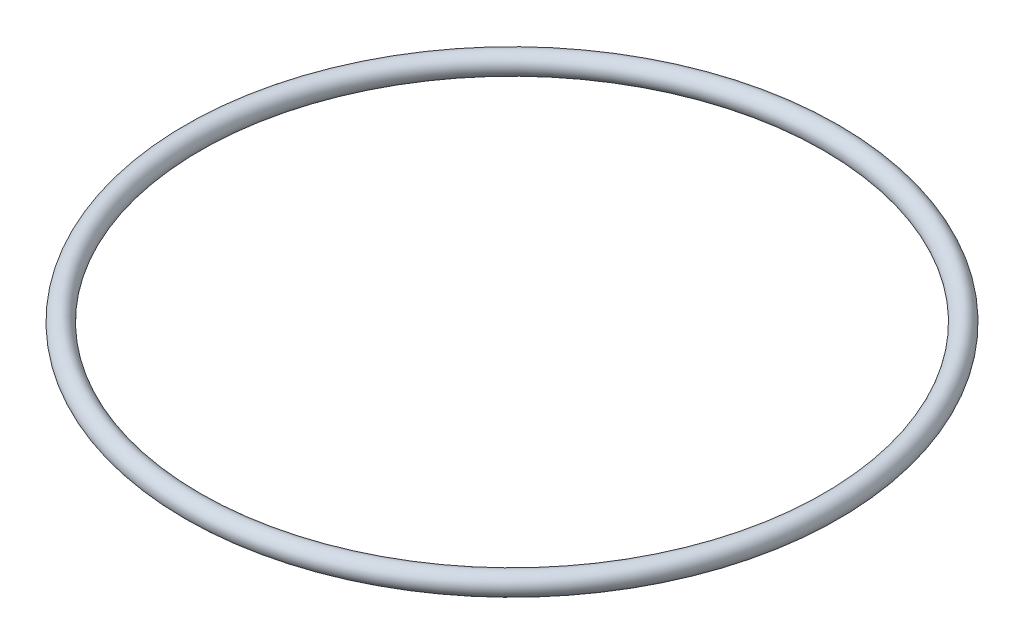
ISO-10303-21;
HEADER;
FILE_DESCRIPTION(('STEP AP214'),'2;1');
FILE_NAME('part.step','',(''),(''),'','','');
FILE_SCHEMA(('AUTOMOTIVE_DESIGN { 1 0 10303 214 1 1 1 1 }'));
ENDSEC;
DATA;
#1=APPLICATION_CONTEXT('core data for automotive mechanical design processes');
#2=APPLICATION_PROTOCOL_DEFINITION('international standard','automotive_design',2000,#1);
#3=PRODUCT_CONTEXT('',#1,'mechanical');
#4=PRODUCT('Part','Part','',(#3));
#5=PRODUCT_RELATED_PRODUCT_CATEGORY('part','',(#4));
#6=PRODUCT_DEFINITION_FORMATION('','',#4);
#7=PRODUCT_DEFINITION_CONTEXT('part definition',#1,'design');
#8=PRODUCT_DEFINITION('design','',#6,#7);
#9=PRODUCT_DEFINITION_SHAPE('','',#8);
#10=(LENGTH_UNIT() NAMED_UNIT(*) SI_UNIT(.MILLI.,.METRE.));
#11=(NAMED_UNIT(*) PLANE_ANGLE_UNIT() SI_UNIT($,.RADIAN.));
#12=(NAMED_UNIT(*) SI_UNIT($,.STERADIAN.) SOLID_ANGLE_UNIT());
#13=UNCERTAINTY_MEASURE_WITH_UNIT(LENGTH_MEASURE(1.E-05),#10,'distance_accuracy_value','');
#14=(GEOMETRIC_REPRESENTATION_CONTEXT(3) GLOBAL_UNCERTAINTY_ASSIGNED_CONTEXT((#13)) GLOBAL_UNIT_ASSIGNED_CONTEXT((#10,
#11,#12)) REPRESENTATION_CONTEXT('',''));
#15=CARTESIAN_POINT('',(0.,0.,0.));
#16=DIRECTION('',(0.,0.,1.));
#17=DIRECTION('',(1.,0.,0.));
#18=AXIS2_PLACEMENT_3D('',#15,#16,#17);
#19=CARTESIAN_POINT('',(0.,0.,0.));
#20=DIRECTION('',(0.,-1.,0.));
#21=DIRECTION('',(0.,0.,-1.));
#22=AXIS2_PLACEMENT_3D('',#19,#20,#21);
#23=TOROIDAL_SURFACE('',#22,53.95,1.76500000000001);
#24=CARTESIAN_POINT('',(0.,0.,-55.715));
#25=VERTEX_POINT('',#24);
#26=VERTEX_LOOP('',#25);
#27=FACE_BOUND('',#26,.T.);
#28=ADVANCED_FACE('F32',(#27),#23,.T.);
#29=CLOSED_SHELL('',(#28));
#30=MANIFOLD_SOLID_BREP('B2',#29);
#31=ADVANCED_BREP_SHAPE_REPRESENTATION('',(#18,#30),#14);
#32=SHAPE_DEFINITION_REPRESENTATION(#9,#31);
ENDSEC;
END-ISO-10303-21;
